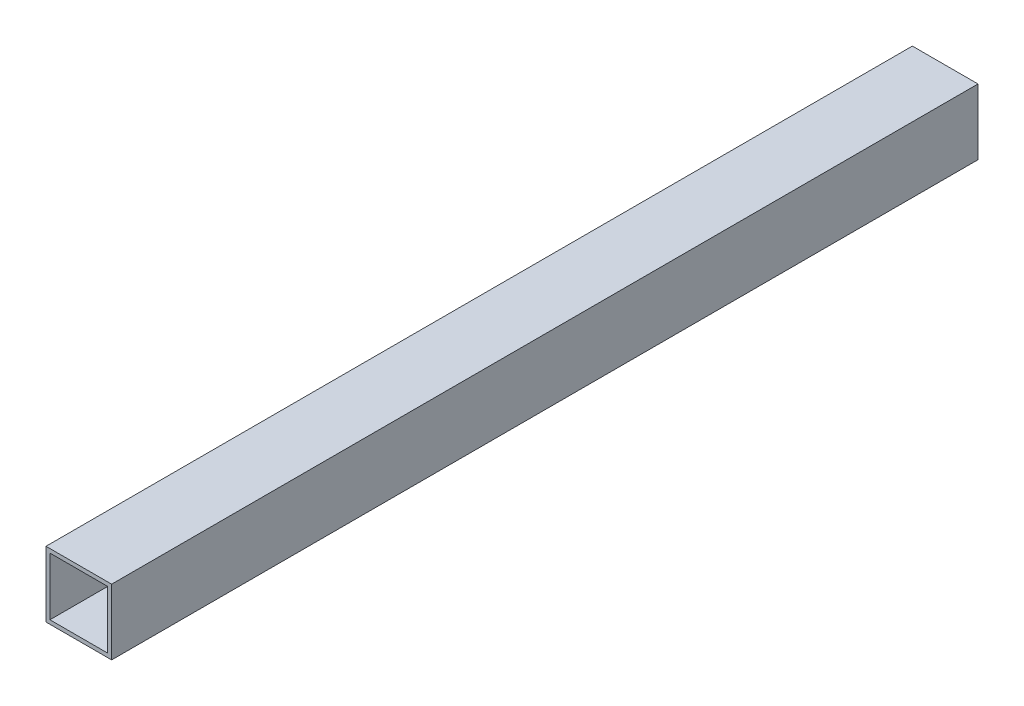
ISO-10303-21;
HEADER;
FILE_DESCRIPTION(('STEP AP214'),'2;1');
FILE_NAME('part.step','',(''),(''),'','','');
FILE_SCHEMA(('AUTOMOTIVE_DESIGN { 1 0 10303 214 1 1 1 1 }'));
ENDSEC;
DATA;
#1=APPLICATION_CONTEXT('core data for automotive mechanical design processes');
#2=APPLICATION_PROTOCOL_DEFINITION('international standard','automotive_design',2000,#1);
#3=PRODUCT_CONTEXT('',#1,'mechanical');
#4=PRODUCT('Part','Part','',(#3));
#5=PRODUCT_RELATED_PRODUCT_CATEGORY('part','',(#4));
#6=PRODUCT_DEFINITION_FORMATION('','',#4);
#7=PRODUCT_DEFINITION_CONTEXT('part definition',#1,'design');
#8=PRODUCT_DEFINITION('design','',#6,#7);
#9=PRODUCT_DEFINITION_SHAPE('','',#8);
#10=(LENGTH_UNIT() NAMED_UNIT(*) SI_UNIT(.MILLI.,.METRE.));
#11=(NAMED_UNIT(*) PLANE_ANGLE_UNIT() SI_UNIT($,.RADIAN.));
#12=(NAMED_UNIT(*) SI_UNIT($,.STERADIAN.) SOLID_ANGLE_UNIT());
#13=UNCERTAINTY_MEASURE_WITH_UNIT(LENGTH_MEASURE(1.E-05),#10,'distance_accuracy_value','');
#14=(GEOMETRIC_REPRESENTATION_CONTEXT(3) GLOBAL_UNCERTAINTY_ASSIGNED_CONTEXT((#13)) GLOBAL_UNIT_ASSIGNED_CONTEXT((#10,
#11,#12)) REPRESENTATION_CONTEXT('',''));
#15=CARTESIAN_POINT('',(0.,0.,0.));
#16=DIRECTION('',(0.,0.,1.));
#17=DIRECTION('',(1.,0.,0.));
#18=AXIS2_PLACEMENT_3D('',#15,#16,#17);
#19=CARTESIAN_POINT('',(0.,0.,330.));
#20=DIRECTION('',(0.,0.,1.));
#21=DIRECTION('',(1.,0.,0.));
#22=AXIS2_PLACEMENT_3D('',#19,#20,#21);
#23=PLANE('',#22);
#24=DIRECTION('',(0.,1.,0.));
#25=VECTOR('',#24,1.);
#26=CARTESIAN_POINT('',(12.5,-12.5,330.));
#27=LINE('',#26,#25);
#28=CARTESIAN_POINT('',(12.5,-12.5,330.));
#29=VERTEX_POINT('',#28);
#30=CARTESIAN_POINT('',(12.5,12.5,330.));
#31=VERTEX_POINT('',#30);
#32=EDGE_CURVE('E157',#29,#31,#27,.T.);
#33=ORIENTED_EDGE('',*,*,#32,.T.);
#34=DIRECTION('',(-1.,0.,0.));
#35=VECTOR('',#34,1.);
#36=CARTESIAN_POINT('',(-12.5,12.5,330.));
#37=LINE('',#36,#35);
#38=CARTESIAN_POINT('',(-12.5,12.5,330.));
#39=VERTEX_POINT('',#38);
#40=EDGE_CURVE('E160',#31,#39,#37,.T.);
#41=ORIENTED_EDGE('',*,*,#40,.T.);
#42=DIRECTION('',(0.,-1.,0.));
#43=VECTOR('',#42,1.);
#44=CARTESIAN_POINT('',(-12.5,-12.5,330.));
#45=LINE('',#44,#43);
#46=CARTESIAN_POINT('',(-12.5,-12.5,330.));
#47=VERTEX_POINT('',#46);
#48=EDGE_CURVE('E163',#39,#47,#45,.T.);
#49=ORIENTED_EDGE('',*,*,#48,.T.);
#50=DIRECTION('',(1.,0.,0.));
#51=VECTOR('',#50,1.);
#52=CARTESIAN_POINT('',(-12.5,-12.5,330.));
#53=LINE('',#52,#51);
#54=EDGE_CURVE('E165',#47,#29,#53,.T.);
#55=ORIENTED_EDGE('',*,*,#54,.T.);
#56=EDGE_LOOP('',(#33,#41,#49,#55));
#57=FACE_BOUND('',#56,.T.);
#58=DIRECTION('',(-1.,0.,0.));
#59=VECTOR('',#58,1.);
#60=CARTESIAN_POINT('',(0.,11.,330.));
#61=LINE('',#60,#59);
#62=CARTESIAN_POINT('',(11.,11.,330.));
#63=VERTEX_POINT('',#62);
#64=CARTESIAN_POINT('',(-11.,11.,330.));
#65=VERTEX_POINT('',#64);
#66=EDGE_CURVE('E129',#63,#65,#61,.T.);
#67=ORIENTED_EDGE('',*,*,#66,.F.);
#68=DIRECTION('',(0.,1.,0.));
#69=VECTOR('',#68,1.);
#70=CARTESIAN_POINT('',(11.,0.,330.));
#71=LINE('',#70,#69);
#72=CARTESIAN_POINT('',(11.,-11.,330.));
#73=VERTEX_POINT('',#72);
#74=EDGE_CURVE('E121',#73,#63,#71,.T.);
#75=ORIENTED_EDGE('',*,*,#74,.F.);
#76=DIRECTION('',(1.,0.,0.));
#77=VECTOR('',#76,1.);
#78=CARTESIAN_POINT('',(0.,-11.,330.));
#79=LINE('',#78,#77);
#80=CARTESIAN_POINT('',(-11.,-11.,330.));
#81=VERTEX_POINT('',#80);
#82=EDGE_CURVE('E143',#81,#73,#79,.T.);
#83=ORIENTED_EDGE('',*,*,#82,.F.);
#84=DIRECTION('',(0.,-1.,0.));
#85=VECTOR('',#84,1.);
#86=CARTESIAN_POINT('',(-11.,0.,330.));
#87=LINE('',#86,#85);
#88=EDGE_CURVE('E141',#65,#81,#87,.T.);
#89=ORIENTED_EDGE('',*,*,#88,.F.);
#90=EDGE_LOOP('',(#67,#75,#83,#89));
#91=FACE_BOUND('',#90,.T.);
#92=ADVANCED_FACE('F56',(#57,#91),#23,.T.);
#93=CARTESIAN_POINT('',(0.,0.,0.));
#94=DIRECTION('',(0.,0.,1.));
#95=DIRECTION('',(1.,0.,0.));
#96=AXIS2_PLACEMENT_3D('',#93,#94,#95);
#97=PLANE('',#96);
#98=DIRECTION('',(0.,1.,0.));
#99=VECTOR('',#98,1.);
#100=CARTESIAN_POINT('',(12.5,-12.5,0.));
#101=LINE('',#100,#99);
#102=CARTESIAN_POINT('',(12.5,-12.5,0.));
#103=VERTEX_POINT('',#102);
#104=CARTESIAN_POINT('',(12.5,12.5,0.));
#105=VERTEX_POINT('',#104);
#106=EDGE_CURVE('E137',#103,#105,#101,.T.);
#107=ORIENTED_EDGE('',*,*,#106,.F.);
#108=DIRECTION('',(1.,0.,0.));
#109=VECTOR('',#108,1.);
#110=CARTESIAN_POINT('',(-12.5,-12.5,0.));
#111=LINE('',#110,#109);
#112=CARTESIAN_POINT('',(-12.5,-12.5,0.));
#113=VERTEX_POINT('',#112);
#114=EDGE_CURVE('E161',#113,#103,#111,.T.);
#115=ORIENTED_EDGE('',*,*,#114,.F.);
#116=DIRECTION('',(0.,-1.,0.));
#117=VECTOR('',#116,1.);
#118=CARTESIAN_POINT('',(-12.5,-12.5,0.));
#119=LINE('',#118,#117);
#120=CARTESIAN_POINT('',(-12.5,12.5,0.));
#121=VERTEX_POINT('',#120);
#122=EDGE_CURVE('E172',#121,#113,#119,.T.);
#123=ORIENTED_EDGE('',*,*,#122,.F.);
#124=DIRECTION('',(-1.,0.,0.));
#125=VECTOR('',#124,1.);
#126=CARTESIAN_POINT('',(-12.5,12.5,0.));
#127=LINE('',#126,#125);
#128=EDGE_CURVE('E170',#105,#121,#127,.T.);
#129=ORIENTED_EDGE('',*,*,#128,.F.);
#130=EDGE_LOOP('',(#107,#115,#123,#129));
#131=FACE_BOUND('',#130,.T.);
#132=DIRECTION('',(0.,1.,0.));
#133=VECTOR('',#132,1.);
#134=CARTESIAN_POINT('',(11.,0.,0.));
#135=LINE('',#134,#133);
#136=CARTESIAN_POINT('',(11.,-11.,0.));
#137=VERTEX_POINT('',#136);
#138=CARTESIAN_POINT('',(11.,11.,0.));
#139=VERTEX_POINT('',#138);
#140=EDGE_CURVE('E79',#137,#139,#135,.T.);
#141=ORIENTED_EDGE('',*,*,#140,.T.);
#142=DIRECTION('',(-1.,0.,0.));
#143=VECTOR('',#142,1.);
#144=CARTESIAN_POINT('',(0.,11.,0.));
#145=LINE('',#144,#143);
#146=CARTESIAN_POINT('',(-11.,11.,0.));
#147=VERTEX_POINT('',#146);
#148=EDGE_CURVE('E136',#139,#147,#145,.T.);
#149=ORIENTED_EDGE('',*,*,#148,.T.);
#150=DIRECTION('',(0.,-1.,0.));
#151=VECTOR('',#150,1.);
#152=CARTESIAN_POINT('',(-11.,0.,0.));
#153=LINE('',#152,#151);
#154=CARTESIAN_POINT('',(-11.,-11.,0.));
#155=VERTEX_POINT('',#154);
#156=EDGE_CURVE('E149',#147,#155,#153,.T.);
#157=ORIENTED_EDGE('',*,*,#156,.T.);
#158=DIRECTION('',(1.,0.,0.));
#159=VECTOR('',#158,1.);
#160=CARTESIAN_POINT('',(0.,-11.,0.));
#161=LINE('',#160,#159);
#162=EDGE_CURVE('E130',#155,#137,#161,.T.);
#163=ORIENTED_EDGE('',*,*,#162,.T.);
#164=EDGE_LOOP('',(#141,#149,#157,#163));
#165=FACE_BOUND('',#164,.T.);
#166=ADVANCED_FACE('F190',(#131,#165),#97,.F.);
#167=CARTESIAN_POINT('',(12.5,-12.5,330.));
#168=DIRECTION('',(-1.,0.,0.));
#169=DIRECTION('',(0.,0.,1.));
#170=AXIS2_PLACEMENT_3D('',#167,#168,#169);
#171=PLANE('',#170);
#172=ORIENTED_EDGE('',*,*,#106,.T.);
#173=DIRECTION('',(0.,0.,-1.));
#174=VECTOR('',#173,1.);
#175=CARTESIAN_POINT('',(12.5,12.5,330.));
#176=LINE('',#175,#174);
#177=EDGE_CURVE('E12',#31,#105,#176,.T.);
#178=ORIENTED_EDGE('',*,*,#177,.F.);
#179=ORIENTED_EDGE('',*,*,#32,.F.);
#180=DIRECTION('',(0.,0.,-1.));
#181=VECTOR('',#180,1.);
#182=CARTESIAN_POINT('',(12.5,-12.5,330.));
#183=LINE('',#182,#181);
#184=EDGE_CURVE('E167',#29,#103,#183,.T.);
#185=ORIENTED_EDGE('',*,*,#184,.T.);
#186=EDGE_LOOP('',(#172,#178,#179,#185));
#187=FACE_BOUND('',#186,.T.);
#188=ADVANCED_FACE('F58',(#187),#171,.F.);
#189=CARTESIAN_POINT('',(-12.5,12.5,330.));
#190=DIRECTION('',(0.,-1.,0.));
#191=DIRECTION('',(0.,0.,-1.));
#192=AXIS2_PLACEMENT_3D('',#189,#190,#191);
#193=PLANE('',#192);
#194=ORIENTED_EDGE('',*,*,#128,.T.);
#195=DIRECTION('',(0.,0.,-1.));
#196=VECTOR('',#195,1.);
#197=CARTESIAN_POINT('',(-12.5,12.5,330.));
#198=LINE('',#197,#196);
#199=EDGE_CURVE('E64',#39,#121,#198,.T.);
#200=ORIENTED_EDGE('',*,*,#199,.F.);
#201=ORIENTED_EDGE('',*,*,#40,.F.);
#202=ORIENTED_EDGE('',*,*,#177,.T.);
#203=EDGE_LOOP('',(#194,#200,#201,#202));
#204=FACE_BOUND('',#203,.T.);
#205=ADVANCED_FACE('F200',(#204),#193,.F.);
#206=CARTESIAN_POINT('',(-12.5,-12.5,330.));
#207=DIRECTION('',(1.,0.,0.));
#208=DIRECTION('',(0.,0.,-1.));
#209=AXIS2_PLACEMENT_3D('',#206,#207,#208);
#210=PLANE('',#209);
#211=ORIENTED_EDGE('',*,*,#122,.T.);
#212=DIRECTION('',(0.,0.,-1.));
#213=VECTOR('',#212,1.);
#214=CARTESIAN_POINT('',(-12.5,-12.5,330.));
#215=LINE('',#214,#213);
#216=EDGE_CURVE('E177',#47,#113,#215,.T.);
#217=ORIENTED_EDGE('',*,*,#216,.F.);
#218=ORIENTED_EDGE('',*,*,#48,.F.);
#219=ORIENTED_EDGE('',*,*,#199,.T.);
#220=EDGE_LOOP('',(#211,#217,#218,#219));
#221=FACE_BOUND('',#220,.T.);
#222=ADVANCED_FACE('F184',(#221),#210,.F.);
#223=CARTESIAN_POINT('',(-12.5,-12.5,330.));
#224=DIRECTION('',(0.,1.,0.));
#225=DIRECTION('',(0.,0.,1.));
#226=AXIS2_PLACEMENT_3D('',#223,#224,#225);
#227=PLANE('',#226);
#228=ORIENTED_EDGE('',*,*,#114,.T.);
#229=ORIENTED_EDGE('',*,*,#184,.F.);
#230=ORIENTED_EDGE('',*,*,#54,.F.);
#231=ORIENTED_EDGE('',*,*,#216,.T.);
#232=EDGE_LOOP('',(#228,#229,#230,#231));
#233=FACE_BOUND('',#232,.T.);
#234=ADVANCED_FACE('F194',(#233),#227,.F.);
#235=CARTESIAN_POINT('',(11.,0.,330.));
#236=DIRECTION('',(-1.,0.,0.));
#237=DIRECTION('',(0.,0.,1.));
#238=AXIS2_PLACEMENT_3D('',#235,#236,#237);
#239=PLANE('',#238);
#240=ORIENTED_EDGE('',*,*,#140,.F.);
#241=DIRECTION('',(0.,0.,-1.));
#242=VECTOR('',#241,1.);
#243=CARTESIAN_POINT('',(11.,-11.,330.));
#244=LINE('',#243,#242);
#245=EDGE_CURVE('E125',#73,#137,#244,.T.);
#246=ORIENTED_EDGE('',*,*,#245,.F.);
#247=ORIENTED_EDGE('',*,*,#74,.T.);
#248=DIRECTION('',(0.,0.,-1.));
#249=VECTOR('',#248,1.);
#250=CARTESIAN_POINT('',(11.,11.,330.));
#251=LINE('',#250,#249);
#252=EDGE_CURVE('E124',#63,#139,#251,.T.);
#253=ORIENTED_EDGE('',*,*,#252,.T.);
#254=EDGE_LOOP('',(#240,#246,#247,#253));
#255=FACE_BOUND('',#254,.T.);
#256=ADVANCED_FACE('F123',(#255),#239,.T.);
#257=CARTESIAN_POINT('',(0.,11.,330.));
#258=DIRECTION('',(0.,-1.,0.));
#259=DIRECTION('',(0.,0.,-1.));
#260=AXIS2_PLACEMENT_3D('',#257,#258,#259);
#261=PLANE('',#260);
#262=ORIENTED_EDGE('',*,*,#148,.F.);
#263=ORIENTED_EDGE('',*,*,#252,.F.);
#264=ORIENTED_EDGE('',*,*,#66,.T.);
#265=DIRECTION('',(0.,0.,-1.));
#266=VECTOR('',#265,1.);
#267=CARTESIAN_POINT('',(-11.,11.,330.));
#268=LINE('',#267,#266);
#269=EDGE_CURVE('E138',#65,#147,#268,.T.);
#270=ORIENTED_EDGE('',*,*,#269,.T.);
#271=EDGE_LOOP('',(#262,#263,#264,#270));
#272=FACE_BOUND('',#271,.T.);
#273=ADVANCED_FACE('F133',(#272),#261,.T.);
#274=CARTESIAN_POINT('',(-11.,0.,330.));
#275=DIRECTION('',(1.,0.,0.));
#276=DIRECTION('',(0.,0.,-1.));
#277=AXIS2_PLACEMENT_3D('',#274,#275,#276);
#278=PLANE('',#277);
#279=ORIENTED_EDGE('',*,*,#156,.F.);
#280=ORIENTED_EDGE('',*,*,#269,.F.);
#281=ORIENTED_EDGE('',*,*,#88,.T.);
#282=DIRECTION('',(0.,0.,-1.));
#283=VECTOR('',#282,1.);
#284=CARTESIAN_POINT('',(-11.,-11.,330.));
#285=LINE('',#284,#283);
#286=EDGE_CURVE('E71',#81,#155,#285,.T.);
#287=ORIENTED_EDGE('',*,*,#286,.T.);
#288=EDGE_LOOP('',(#279,#280,#281,#287));
#289=FACE_BOUND('',#288,.T.);
#290=ADVANCED_FACE('F223',(#289),#278,.T.);
#291=CARTESIAN_POINT('',(0.,-11.,330.));
#292=DIRECTION('',(0.,1.,0.));
#293=DIRECTION('',(0.,0.,1.));
#294=AXIS2_PLACEMENT_3D('',#291,#292,#293);
#295=PLANE('',#294);
#296=ORIENTED_EDGE('',*,*,#162,.F.);
#297=ORIENTED_EDGE('',*,*,#286,.F.);
#298=ORIENTED_EDGE('',*,*,#82,.T.);
#299=ORIENTED_EDGE('',*,*,#245,.T.);
#300=EDGE_LOOP('',(#296,#297,#298,#299));
#301=FACE_BOUND('',#300,.T.);
#302=ADVANCED_FACE('F227',(#301),#295,.T.);
#303=CLOSED_SHELL('',(#92,#166,#188,#205,#222,#234,#256,#273,#290,#302));
#304=MANIFOLD_SOLID_BREP('B2',#303);
#305=ADVANCED_BREP_SHAPE_REPRESENTATION('',(#18,#304),#14);
#306=SHAPE_DEFINITION_REPRESENTATION(#9,#305);
ENDSEC;
END-ISO-10303-21;
